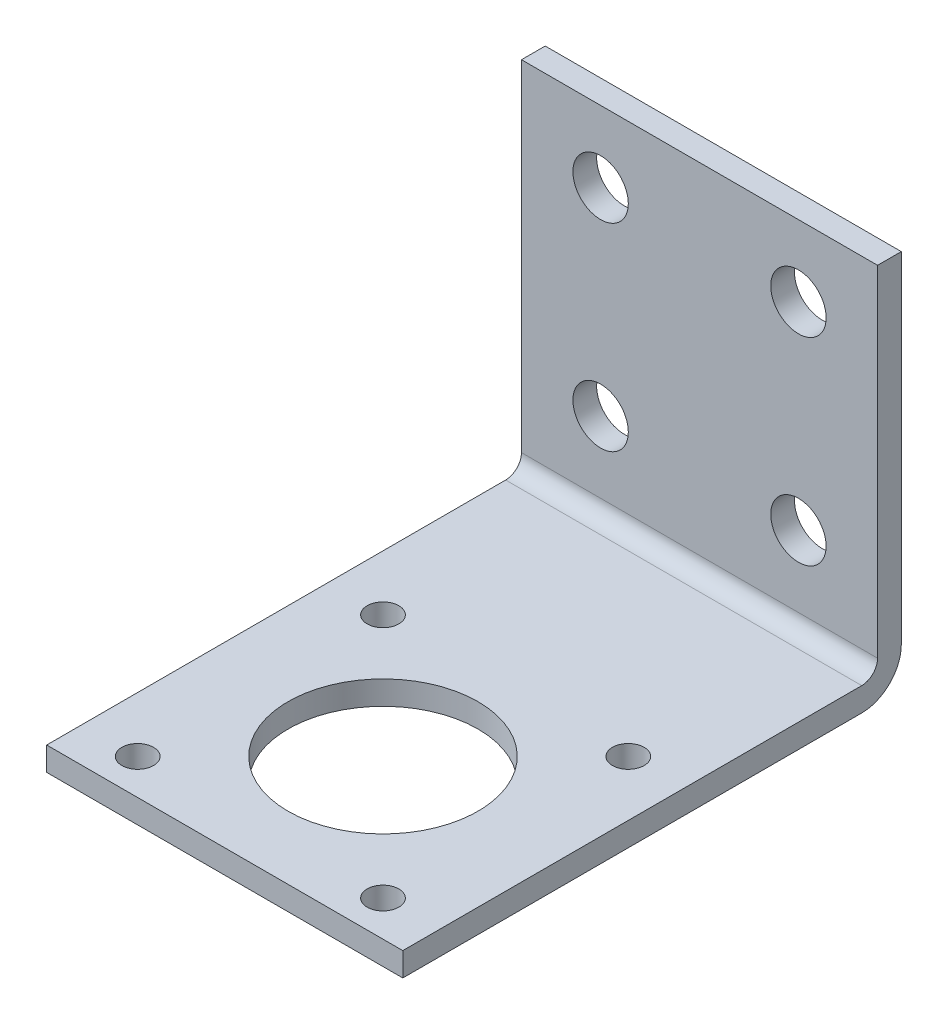
ISO-10303-21;
HEADER;
FILE_DESCRIPTION(('STEP AP214'),'2;1');
FILE_NAME('part.step','',(''),(''),'','','');
FILE_SCHEMA(('AUTOMOTIVE_DESIGN { 1 0 10303 214 1 1 1 1 }'));
ENDSEC;
DATA;
#1=APPLICATION_CONTEXT('core data for automotive mechanical design processes');
#2=APPLICATION_PROTOCOL_DEFINITION('international standard','automotive_design',2000,#1);
#3=PRODUCT_CONTEXT('',#1,'mechanical');
#4=PRODUCT('Part','Part','',(#3));
#5=PRODUCT_RELATED_PRODUCT_CATEGORY('part','',(#4));
#6=PRODUCT_DEFINITION_FORMATION('','',#4);
#7=PRODUCT_DEFINITION_CONTEXT('part definition',#1,'design');
#8=PRODUCT_DEFINITION('design','',#6,#7);
#9=PRODUCT_DEFINITION_SHAPE('','',#8);
#10=(LENGTH_UNIT() NAMED_UNIT(*) SI_UNIT(.MILLI.,.METRE.));
#11=(NAMED_UNIT(*) PLANE_ANGLE_UNIT() SI_UNIT($,.RADIAN.));
#12=(NAMED_UNIT(*) SI_UNIT($,.STERADIAN.) SOLID_ANGLE_UNIT());
#13=UNCERTAINTY_MEASURE_WITH_UNIT(LENGTH_MEASURE(1.E-05),#10,'distance_accuracy_value','');
#14=(GEOMETRIC_REPRESENTATION_CONTEXT(3) GLOBAL_UNCERTAINTY_ASSIGNED_CONTEXT((#13)) GLOBAL_UNIT_ASSIGNED_CONTEXT((#10,
#11,#12)) REPRESENTATION_CONTEXT('',''));
#15=CARTESIAN_POINT('',(0.,0.,0.));
#16=DIRECTION('',(0.,0.,1.));
#17=DIRECTION('',(1.,0.,0.));
#18=AXIS2_PLACEMENT_3D('',#15,#16,#17);
#19=CARTESIAN_POINT('',(45.,0.,63.));
#20=DIRECTION('',(0.,1.,0.));
#21=DIRECTION('',(0.,0.,1.));
#22=AXIS2_PLACEMENT_3D('',#19,#20,#21);
#23=PLANE('',#22);
#24=CARTESIAN_POINT('',(22.5,0.,43.));
#25=DIRECTION('',(0.,-1.,0.));
#26=DIRECTION('',(0.,0.,-1.));
#27=AXIS2_PLACEMENT_3D('',#24,#25,#26);
#28=CIRCLE('',#27,12.);
#29=CARTESIAN_POINT('',(22.5,0.,31.));
#30=VERTEX_POINT('',#29);
#31=EDGE_CURVE('E206',#30,#30,#28,.T.);
#32=ORIENTED_EDGE('',*,*,#31,.F.);
#33=EDGE_LOOP('',(#32));
#34=FACE_BOUND('',#33,.T.);
#35=CARTESIAN_POINT('',(7.,0.,27.5));
#36=DIRECTION('',(0.,-1.,0.));
#37=DIRECTION('',(0.,0.,-1.));
#38=AXIS2_PLACEMENT_3D('',#35,#36,#37);
#39=CIRCLE('',#38,2.);
#40=CARTESIAN_POINT('',(7.,0.,25.5));
#41=VERTEX_POINT('',#40);
#42=EDGE_CURVE('E200',#41,#41,#39,.T.);
#43=ORIENTED_EDGE('',*,*,#42,.F.);
#44=EDGE_LOOP('',(#43));
#45=FACE_BOUND('',#44,.T.);
#46=CARTESIAN_POINT('',(7.,0.,58.5));
#47=DIRECTION('',(0.,-1.,0.));
#48=DIRECTION('',(0.,0.,-1.));
#49=AXIS2_PLACEMENT_3D('',#46,#47,#48);
#50=CIRCLE('',#49,2.);
#51=CARTESIAN_POINT('',(7.,0.,56.5));
#52=VERTEX_POINT('',#51);
#53=EDGE_CURVE('E194',#52,#52,#50,.T.);
#54=ORIENTED_EDGE('',*,*,#53,.F.);
#55=EDGE_LOOP('',(#54));
#56=FACE_BOUND('',#55,.T.);
#57=CARTESIAN_POINT('',(38.,0.,27.5));
#58=DIRECTION('',(0.,-1.,0.));
#59=DIRECTION('',(0.,0.,-1.));
#60=AXIS2_PLACEMENT_3D('',#57,#58,#59);
#61=CIRCLE('',#60,2.);
#62=CARTESIAN_POINT('',(38.,0.,25.5));
#63=VERTEX_POINT('',#62);
#64=EDGE_CURVE('E188',#63,#63,#61,.T.);
#65=ORIENTED_EDGE('',*,*,#64,.F.);
#66=EDGE_LOOP('',(#65));
#67=FACE_BOUND('',#66,.T.);
#68=CARTESIAN_POINT('',(38.,0.,58.5));
#69=DIRECTION('',(0.,-1.,0.));
#70=DIRECTION('',(0.,0.,-1.));
#71=AXIS2_PLACEMENT_3D('',#68,#69,#70);
#72=CIRCLE('',#71,2.);
#73=CARTESIAN_POINT('',(38.,0.,56.5));
#74=VERTEX_POINT('',#73);
#75=EDGE_CURVE('E182',#74,#74,#72,.T.);
#76=ORIENTED_EDGE('',*,*,#75,.F.);
#77=EDGE_LOOP('',(#76));
#78=FACE_BOUND('',#77,.T.);
#79=DIRECTION('',(0.,0.,-1.));
#80=VECTOR('',#79,1.);
#81=CARTESIAN_POINT('',(0.,0.,63.));
#82=LINE('',#81,#80);
#83=CARTESIAN_POINT('',(0.,0.,63.));
#84=VERTEX_POINT('',#83);
#85=CARTESIAN_POINT('',(0.,0.,5.));
#86=VERTEX_POINT('',#85);
#87=EDGE_CURVE('E130',#84,#86,#82,.T.);
#88=ORIENTED_EDGE('',*,*,#87,.T.);
#89=DIRECTION('',(-1.,0.,0.));
#90=VECTOR('',#89,1.);
#91=CARTESIAN_POINT('',(45.,0.,5.));
#92=LINE('',#91,#90);
#93=CARTESIAN_POINT('',(45.,0.,5.));
#94=VERTEX_POINT('',#93);
#95=EDGE_CURVE('E39',#86,#94,#92,.F.);
#96=ORIENTED_EDGE('',*,*,#95,.T.);
#97=DIRECTION('',(0.,0.,-1.));
#98=VECTOR('',#97,1.);
#99=CARTESIAN_POINT('',(45.,0.,63.));
#100=LINE('',#99,#98);
#101=CARTESIAN_POINT('',(45.,0.,63.));
#102=VERTEX_POINT('',#101);
#103=EDGE_CURVE('E106',#102,#94,#100,.T.);
#104=ORIENTED_EDGE('',*,*,#103,.F.);
#105=DIRECTION('',(-1.,0.,0.));
#106=VECTOR('',#105,1.);
#107=CARTESIAN_POINT('',(45.,0.,63.));
#108=LINE('',#107,#106);
#109=EDGE_CURVE('E129',#102,#84,#108,.T.);
#110=ORIENTED_EDGE('',*,*,#109,.T.);
#111=EDGE_LOOP('',(#88,#96,#104,#110));
#112=FACE_BOUND('',#111,.T.);
#113=ADVANCED_FACE('F31',(#34,#45,#56,#67,#78,#112),#23,.F.);
#114=CARTESIAN_POINT('',(45.,0.,0.));
#115=DIRECTION('',(0.,0.,1.));
#116=DIRECTION('',(0.,-1.,0.));
#117=AXIS2_PLACEMENT_3D('',#114,#115,#116);
#118=PLANE('',#117);
#119=CARTESIAN_POINT('',(10.,14.,0.));
#120=DIRECTION('',(0.,0.,1.));
#121=DIRECTION('',(1.,0.,0.));
#122=AXIS2_PLACEMENT_3D('',#119,#120,#121);
#123=CIRCLE('',#122,3.5);
#124=CARTESIAN_POINT('',(13.5,14.,0.));
#125=VERTEX_POINT('',#124);
#126=EDGE_CURVE('E225',#125,#125,#123,.T.);
#127=ORIENTED_EDGE('',*,*,#126,.T.);
#128=EDGE_LOOP('',(#127));
#129=FACE_BOUND('',#128,.T.);
#130=CARTESIAN_POINT('',(10.,39.,0.));
#131=DIRECTION('',(0.,0.,1.));
#132=DIRECTION('',(1.,0.,0.));
#133=AXIS2_PLACEMENT_3D('',#130,#131,#132);
#134=CIRCLE('',#133,3.5);
#135=CARTESIAN_POINT('',(13.5,39.,0.));
#136=VERTEX_POINT('',#135);
#137=EDGE_CURVE('E219',#136,#136,#134,.T.);
#138=ORIENTED_EDGE('',*,*,#137,.T.);
#139=EDGE_LOOP('',(#138));
#140=FACE_BOUND('',#139,.T.);
#141=CARTESIAN_POINT('',(35.,14.,0.));
#142=DIRECTION('',(0.,0.,1.));
#143=DIRECTION('',(1.,0.,0.));
#144=AXIS2_PLACEMENT_3D('',#141,#142,#143);
#145=CIRCLE('',#144,3.5);
#146=CARTESIAN_POINT('',(38.5,14.,0.));
#147=VERTEX_POINT('',#146);
#148=EDGE_CURVE('E213',#147,#147,#145,.T.);
#149=ORIENTED_EDGE('',*,*,#148,.T.);
#150=EDGE_LOOP('',(#149));
#151=FACE_BOUND('',#150,.T.);
#152=CARTESIAN_POINT('',(35.,39.,0.));
#153=DIRECTION('',(0.,0.,1.));
#154=DIRECTION('',(1.,0.,0.));
#155=AXIS2_PLACEMENT_3D('',#152,#153,#154);
#156=CIRCLE('',#155,3.5);
#157=CARTESIAN_POINT('',(38.5,39.,0.));
#158=VERTEX_POINT('',#157);
#159=EDGE_CURVE('E209',#158,#158,#156,.T.);
#160=ORIENTED_EDGE('',*,*,#159,.T.);
#161=EDGE_LOOP('',(#160));
#162=FACE_BOUND('',#161,.T.);
#163=DIRECTION('',(0.,1.,0.));
#164=VECTOR('',#163,1.);
#165=CARTESIAN_POINT('',(45.,0.,0.));
#166=LINE('',#165,#164);
#167=CARTESIAN_POINT('',(45.,5.,0.));
#168=VERTEX_POINT('',#167);
#169=CARTESIAN_POINT('',(45.,48.,0.));
#170=VERTEX_POINT('',#169);
#171=EDGE_CURVE('E95',#168,#170,#166,.T.);
#172=ORIENTED_EDGE('',*,*,#171,.F.);
#173=DIRECTION('',(-1.,0.,0.));
#174=VECTOR('',#173,1.);
#175=CARTESIAN_POINT('',(45.,5.,0.));
#176=LINE('',#175,#174);
#177=CARTESIAN_POINT('',(0.,5.,0.));
#178=VERTEX_POINT('',#177);
#179=EDGE_CURVE('E157',#168,#178,#176,.T.);
#180=ORIENTED_EDGE('',*,*,#179,.T.);
#181=DIRECTION('',(0.,1.,0.));
#182=VECTOR('',#181,1.);
#183=CARTESIAN_POINT('',(0.,0.,0.));
#184=LINE('',#183,#182);
#185=CARTESIAN_POINT('',(0.,48.,0.));
#186=VERTEX_POINT('',#185);
#187=EDGE_CURVE('E111',#178,#186,#184,.T.);
#188=ORIENTED_EDGE('',*,*,#187,.T.);
#189=DIRECTION('',(-1.,0.,0.));
#190=VECTOR('',#189,1.);
#191=CARTESIAN_POINT('',(45.,48.,0.));
#192=LINE('',#191,#190);
#193=EDGE_CURVE('E109',#170,#186,#192,.T.);
#194=ORIENTED_EDGE('',*,*,#193,.F.);
#195=EDGE_LOOP('',(#172,#180,#188,#194));
#196=FACE_BOUND('',#195,.T.);
#197=ADVANCED_FACE('F110',(#129,#140,#151,#162,#196),#118,.F.);
#198=CARTESIAN_POINT('',(45.,48.,0.));
#199=DIRECTION('',(0.,-1.,0.));
#200=DIRECTION('',(0.,0.,-1.));
#201=AXIS2_PLACEMENT_3D('',#198,#199,#200);
#202=PLANE('',#201);
#203=DIRECTION('',(0.,0.,1.));
#204=VECTOR('',#203,1.);
#205=CARTESIAN_POINT('',(0.,48.,0.));
#206=LINE('',#205,#204);
#207=CARTESIAN_POINT('',(0.,48.,3.));
#208=VERTEX_POINT('',#207);
#209=EDGE_CURVE('E134',#186,#208,#206,.T.);
#210=ORIENTED_EDGE('',*,*,#209,.T.);
#211=DIRECTION('',(-1.,0.,0.));
#212=VECTOR('',#211,1.);
#213=CARTESIAN_POINT('',(45.,48.,3.));
#214=LINE('',#213,#212);
#215=CARTESIAN_POINT('',(45.,48.,3.));
#216=VERTEX_POINT('',#215);
#217=EDGE_CURVE('E115',#216,#208,#214,.T.);
#218=ORIENTED_EDGE('',*,*,#217,.F.);
#219=DIRECTION('',(0.,0.,1.));
#220=VECTOR('',#219,1.);
#221=CARTESIAN_POINT('',(45.,48.,0.));
#222=LINE('',#221,#220);
#223=EDGE_CURVE('E100',#170,#216,#222,.T.);
#224=ORIENTED_EDGE('',*,*,#223,.F.);
#225=ORIENTED_EDGE('',*,*,#193,.T.);
#226=EDGE_LOOP('',(#210,#218,#224,#225));
#227=FACE_BOUND('',#226,.T.);
#228=ADVANCED_FACE('F117',(#227),#202,.F.);
#229=CARTESIAN_POINT('',(45.,48.,3.));
#230=DIRECTION('',(0.,0.,-1.));
#231=DIRECTION('',(0.,1.,0.));
#232=AXIS2_PLACEMENT_3D('',#229,#230,#231);
#233=PLANE('',#232);
#234=CARTESIAN_POINT('',(10.,14.,3.));
#235=DIRECTION('',(0.,0.,1.));
#236=DIRECTION('',(1.,0.,0.));
#237=AXIS2_PLACEMENT_3D('',#234,#235,#236);
#238=CIRCLE('',#237,3.5);
#239=CARTESIAN_POINT('',(13.5,14.,3.));
#240=VERTEX_POINT('',#239);
#241=EDGE_CURVE('E228',#240,#240,#238,.T.);
#242=ORIENTED_EDGE('',*,*,#241,.F.);
#243=EDGE_LOOP('',(#242));
#244=FACE_BOUND('',#243,.T.);
#245=CARTESIAN_POINT('',(10.,39.,3.));
#246=DIRECTION('',(0.,0.,1.));
#247=DIRECTION('',(1.,0.,0.));
#248=AXIS2_PLACEMENT_3D('',#245,#246,#247);
#249=CIRCLE('',#248,3.5);
#250=CARTESIAN_POINT('',(13.5,39.,3.));
#251=VERTEX_POINT('',#250);
#252=EDGE_CURVE('E222',#251,#251,#249,.T.);
#253=ORIENTED_EDGE('',*,*,#252,.F.);
#254=EDGE_LOOP('',(#253));
#255=FACE_BOUND('',#254,.T.);
#256=CARTESIAN_POINT('',(35.,14.,3.));
#257=DIRECTION('',(0.,0.,1.));
#258=DIRECTION('',(1.,0.,0.));
#259=AXIS2_PLACEMENT_3D('',#256,#257,#258);
#260=CIRCLE('',#259,3.5);
#261=CARTESIAN_POINT('',(38.5,14.,3.));
#262=VERTEX_POINT('',#261);
#263=EDGE_CURVE('E216',#262,#262,#260,.T.);
#264=ORIENTED_EDGE('',*,*,#263,.F.);
#265=EDGE_LOOP('',(#264));
#266=FACE_BOUND('',#265,.T.);
#267=CARTESIAN_POINT('',(35.,39.,3.));
#268=DIRECTION('',(0.,0.,1.));
#269=DIRECTION('',(1.,0.,0.));
#270=AXIS2_PLACEMENT_3D('',#267,#268,#269);
#271=CIRCLE('',#270,3.5);
#272=CARTESIAN_POINT('',(38.5,39.,3.));
#273=VERTEX_POINT('',#272);
#274=EDGE_CURVE('E210',#273,#273,#271,.T.);
#275=ORIENTED_EDGE('',*,*,#274,.F.);
#276=EDGE_LOOP('',(#275));
#277=FACE_BOUND('',#276,.T.);
#278=DIRECTION('',(0.,-1.,0.));
#279=VECTOR('',#278,1.);
#280=CARTESIAN_POINT('',(0.,48.,3.));
#281=LINE('',#280,#279);
#282=CARTESIAN_POINT('',(0.,5.00000000000002,3.));
#283=VERTEX_POINT('',#282);
#284=EDGE_CURVE('E136',#208,#283,#281,.T.);
#285=ORIENTED_EDGE('',*,*,#284,.T.);
#286=DIRECTION('',(-1.,0.,0.));
#287=VECTOR('',#286,1.);
#288=CARTESIAN_POINT('',(45.,5.,3.));
#289=LINE('',#288,#287);
#290=CARTESIAN_POINT('',(45.,5.00000000000002,3.));
#291=VERTEX_POINT('',#290);
#292=EDGE_CURVE('E151',#283,#291,#289,.F.);
#293=ORIENTED_EDGE('',*,*,#292,.T.);
#294=DIRECTION('',(0.,-1.,0.));
#295=VECTOR('',#294,1.);
#296=CARTESIAN_POINT('',(45.,48.,3.));
#297=LINE('',#296,#295);
#298=EDGE_CURVE('E120',#216,#291,#297,.T.);
#299=ORIENTED_EDGE('',*,*,#298,.F.);
#300=ORIENTED_EDGE('',*,*,#217,.T.);
#301=EDGE_LOOP('',(#285,#293,#299,#300));
#302=FACE_BOUND('',#301,.T.);
#303=ADVANCED_FACE('F163',(#244,#255,#266,#277,#302),#233,.F.);
#304=CARTESIAN_POINT('',(45.,3.00000000000001,3.));
#305=DIRECTION('',(0.,-1.,0.));
#306=DIRECTION('',(0.,0.,-1.));
#307=AXIS2_PLACEMENT_3D('',#304,#305,#306);
#308=PLANE('',#307);
#309=CARTESIAN_POINT('',(22.5,3.,43.));
#310=DIRECTION('',(0.,-1.,0.));
#311=DIRECTION('',(0.,0.,-1.));
#312=AXIS2_PLACEMENT_3D('',#309,#310,#311);
#313=CIRCLE('',#312,12.);
#314=CARTESIAN_POINT('',(22.5,3.,31.));
#315=VERTEX_POINT('',#314);
#316=EDGE_CURVE('E203',#315,#315,#313,.F.);
#317=ORIENTED_EDGE('',*,*,#316,.F.);
#318=EDGE_LOOP('',(#317));
#319=FACE_BOUND('',#318,.T.);
#320=CARTESIAN_POINT('',(7.,3.,27.5));
#321=DIRECTION('',(0.,-1.,0.));
#322=DIRECTION('',(0.,0.,-1.));
#323=AXIS2_PLACEMENT_3D('',#320,#321,#322);
#324=CIRCLE('',#323,2.);
#325=CARTESIAN_POINT('',(7.,3.,25.5));
#326=VERTEX_POINT('',#325);
#327=EDGE_CURVE('E197',#326,#326,#324,.F.);
#328=ORIENTED_EDGE('',*,*,#327,.F.);
#329=EDGE_LOOP('',(#328));
#330=FACE_BOUND('',#329,.T.);
#331=CARTESIAN_POINT('',(7.,3.,58.5));
#332=DIRECTION('',(0.,-1.,0.));
#333=DIRECTION('',(0.,0.,-1.));
#334=AXIS2_PLACEMENT_3D('',#331,#332,#333);
#335=CIRCLE('',#334,2.);
#336=CARTESIAN_POINT('',(7.,3.,56.5));
#337=VERTEX_POINT('',#336);
#338=EDGE_CURVE('E191',#337,#337,#335,.F.);
#339=ORIENTED_EDGE('',*,*,#338,.F.);
#340=EDGE_LOOP('',(#339));
#341=FACE_BOUND('',#340,.T.);
#342=CARTESIAN_POINT('',(38.,3.,27.5));
#343=DIRECTION('',(0.,-1.,0.));
#344=DIRECTION('',(0.,0.,-1.));
#345=AXIS2_PLACEMENT_3D('',#342,#343,#344);
#346=CIRCLE('',#345,2.);
#347=CARTESIAN_POINT('',(38.,3.,25.5));
#348=VERTEX_POINT('',#347);
#349=EDGE_CURVE('E185',#348,#348,#346,.F.);
#350=ORIENTED_EDGE('',*,*,#349,.F.);
#351=EDGE_LOOP('',(#350));
#352=FACE_BOUND('',#351,.T.);
#353=CARTESIAN_POINT('',(38.,3.,58.5));
#354=DIRECTION('',(0.,-1.,0.));
#355=DIRECTION('',(0.,0.,-1.));
#356=AXIS2_PLACEMENT_3D('',#353,#354,#355);
#357=CIRCLE('',#356,2.);
#358=CARTESIAN_POINT('',(38.,3.,56.5));
#359=VERTEX_POINT('',#358);
#360=EDGE_CURVE('E132',#359,#359,#357,.F.);
#361=ORIENTED_EDGE('',*,*,#360,.F.);
#362=EDGE_LOOP('',(#361));
#363=FACE_BOUND('',#362,.T.);
#364=DIRECTION('',(0.,0.,1.));
#365=VECTOR('',#364,1.);
#366=CARTESIAN_POINT('',(45.,3.00000000000001,3.));
#367=LINE('',#366,#365);
#368=CARTESIAN_POINT('',(45.,3.00000000000001,4.99999999999999));
#369=VERTEX_POINT('',#368);
#370=CARTESIAN_POINT('',(45.,3.,63.));
#371=VERTEX_POINT('',#370);
#372=EDGE_CURVE('E122',#369,#371,#367,.T.);
#373=ORIENTED_EDGE('',*,*,#372,.F.);
#374=DIRECTION('',(-1.,0.,0.));
#375=VECTOR('',#374,1.);
#376=CARTESIAN_POINT('',(0.,3.00000000000001,5.));
#377=LINE('',#376,#375);
#378=CARTESIAN_POINT('',(0.,3.00000000000001,4.99999999999999));
#379=VERTEX_POINT('',#378);
#380=EDGE_CURVE('E114',#369,#379,#377,.T.);
#381=ORIENTED_EDGE('',*,*,#380,.T.);
#382=DIRECTION('',(0.,0.,1.));
#383=VECTOR('',#382,1.);
#384=CARTESIAN_POINT('',(0.,3.00000000000001,3.));
#385=LINE('',#384,#383);
#386=CARTESIAN_POINT('',(0.,3.,63.));
#387=VERTEX_POINT('',#386);
#388=EDGE_CURVE('E139',#379,#387,#385,.T.);
#389=ORIENTED_EDGE('',*,*,#388,.T.);
#390=DIRECTION('',(-1.,0.,0.));
#391=VECTOR('',#390,1.);
#392=CARTESIAN_POINT('',(45.,3.,63.));
#393=LINE('',#392,#391);
#394=EDGE_CURVE('E145',#371,#387,#393,.T.);
#395=ORIENTED_EDGE('',*,*,#394,.F.);
#396=EDGE_LOOP('',(#373,#381,#389,#395));
#397=FACE_BOUND('',#396,.T.);
#398=ADVANCED_FACE('F172',(#319,#330,#341,#352,#363,#397),#308,.F.);
#399=CARTESIAN_POINT('',(45.,3.,63.));
#400=DIRECTION('',(0.,0.,-1.));
#401=DIRECTION('',(-1.,0.,0.));
#402=AXIS2_PLACEMENT_3D('',#399,#400,#401);
#403=PLANE('',#402);
#404=DIRECTION('',(0.,-1.,0.));
#405=VECTOR('',#404,1.);
#406=CARTESIAN_POINT('',(0.,3.,63.));
#407=LINE('',#406,#405);
#408=EDGE_CURVE('E141',#387,#84,#407,.T.);
#409=ORIENTED_EDGE('',*,*,#408,.T.);
#410=ORIENTED_EDGE('',*,*,#109,.F.);
#411=DIRECTION('',(0.,-1.,0.));
#412=VECTOR('',#411,1.);
#413=CARTESIAN_POINT('',(45.,3.,63.));
#414=LINE('',#413,#412);
#415=EDGE_CURVE('E127',#371,#102,#414,.T.);
#416=ORIENTED_EDGE('',*,*,#415,.F.);
#417=ORIENTED_EDGE('',*,*,#394,.T.);
#418=EDGE_LOOP('',(#409,#410,#416,#417));
#419=FACE_BOUND('',#418,.T.);
#420=ADVANCED_FACE('F177',(#419),#403,.F.);
#421=CARTESIAN_POINT('',(45.,0.,0.));
#422=DIRECTION('',(1.,0.,0.));
#423=DIRECTION('',(0.,0.,-1.));
#424=AXIS2_PLACEMENT_3D('',#421,#422,#423);
#425=PLANE('',#424);
#426=ORIENTED_EDGE('',*,*,#103,.T.);
#427=CARTESIAN_POINT('',(45.,5.,5.));
#428=DIRECTION('',(1.,0.,0.));
#429=DIRECTION('',(0.,0.,-1.));
#430=AXIS2_PLACEMENT_3D('',#427,#428,#429);
#431=CIRCLE('',#430,5.);
#432=EDGE_CURVE('E11',#94,#168,#431,.T.);
#433=ORIENTED_EDGE('',*,*,#432,.T.);
#434=ORIENTED_EDGE('',*,*,#171,.T.);
#435=ORIENTED_EDGE('',*,*,#223,.T.);
#436=ORIENTED_EDGE('',*,*,#298,.T.);
#437=CARTESIAN_POINT('',(45.,5.,5.));
#438=DIRECTION('',(1.,0.,0.));
#439=DIRECTION('',(0.,0.,-1.));
#440=AXIS2_PLACEMENT_3D('',#437,#438,#439);
#441=CIRCLE('',#440,2.);
#442=EDGE_CURVE('E155',#291,#369,#441,.F.);
#443=ORIENTED_EDGE('',*,*,#442,.T.);
#444=ORIENTED_EDGE('',*,*,#372,.T.);
#445=ORIENTED_EDGE('',*,*,#415,.T.);
#446=EDGE_LOOP('',(#426,#433,#434,#435,#436,#443,#444,#445));
#447=FACE_BOUND('',#446,.T.);
#448=ADVANCED_FACE('F97',(#447),#425,.T.);
#449=CARTESIAN_POINT('',(0.,0.,0.));
#450=DIRECTION('',(1.,0.,0.));
#451=DIRECTION('',(0.,0.,-1.));
#452=AXIS2_PLACEMENT_3D('',#449,#450,#451);
#453=PLANE('',#452);
#454=ORIENTED_EDGE('',*,*,#187,.F.);
#455=CARTESIAN_POINT('',(0.,5.,5.));
#456=DIRECTION('',(1.,0.,0.));
#457=DIRECTION('',(0.,0.,-1.));
#458=AXIS2_PLACEMENT_3D('',#455,#456,#457);
#459=CIRCLE('',#458,5.);
#460=EDGE_CURVE('E53',#178,#86,#459,.F.);
#461=ORIENTED_EDGE('',*,*,#460,.T.);
#462=ORIENTED_EDGE('',*,*,#87,.F.);
#463=ORIENTED_EDGE('',*,*,#408,.F.);
#464=ORIENTED_EDGE('',*,*,#388,.F.);
#465=CARTESIAN_POINT('',(0.,5.,5.));
#466=DIRECTION('',(1.,0.,0.));
#467=DIRECTION('',(0.,0.,-1.));
#468=AXIS2_PLACEMENT_3D('',#465,#466,#467);
#469=CIRCLE('',#468,2.);
#470=EDGE_CURVE('E153',#379,#283,#469,.T.);
#471=ORIENTED_EDGE('',*,*,#470,.T.);
#472=ORIENTED_EDGE('',*,*,#284,.F.);
#473=ORIENTED_EDGE('',*,*,#209,.F.);
#474=EDGE_LOOP('',(#454,#461,#462,#463,#464,#471,#472,#473));
#475=FACE_BOUND('',#474,.T.);
#476=ADVANCED_FACE('F160',(#475),#453,.F.);
#477=CARTESIAN_POINT('',(45.,5.,5.));
#478=DIRECTION('',(1.,0.,0.));
#479=DIRECTION('',(0.,0.,-1.));
#480=AXIS2_PLACEMENT_3D('',#477,#478,#479);
#481=CYLINDRICAL_SURFACE('',#480,2.);
#482=ORIENTED_EDGE('',*,*,#442,.F.);
#483=ORIENTED_EDGE('',*,*,#292,.F.);
#484=ORIENTED_EDGE('',*,*,#470,.F.);
#485=ORIENTED_EDGE('',*,*,#380,.F.);
#486=EDGE_LOOP('',(#482,#483,#484,#485));
#487=FACE_BOUND('',#486,.T.);
#488=ADVANCED_FACE('F169',(#487),#481,.F.);
#489=CARTESIAN_POINT('',(45.,5.,5.));
#490=DIRECTION('',(-1.,0.,0.));
#491=DIRECTION('',(0.,0.,1.));
#492=AXIS2_PLACEMENT_3D('',#489,#490,#491);
#493=CYLINDRICAL_SURFACE('',#492,5.);
#494=ORIENTED_EDGE('',*,*,#432,.F.);
#495=ORIENTED_EDGE('',*,*,#95,.F.);
#496=ORIENTED_EDGE('',*,*,#460,.F.);
#497=ORIENTED_EDGE('',*,*,#179,.F.);
#498=EDGE_LOOP('',(#494,#495,#496,#497));
#499=FACE_BOUND('',#498,.T.);
#500=ADVANCED_FACE('F33',(#499),#493,.T.);
#501=CARTESIAN_POINT('',(38.,48.001,58.5));
#502=DIRECTION('',(0.,-1.,0.));
#503=DIRECTION('',(0.,0.,-1.));
#504=AXIS2_PLACEMENT_3D('',#501,#502,#503);
#505=CYLINDRICAL_SURFACE('',#504,2.);
#506=ORIENTED_EDGE('',*,*,#75,.T.);
#507=EDGE_LOOP('',(#506));
#508=FACE_BOUND('',#507,.T.);
#509=ORIENTED_EDGE('',*,*,#360,.T.);
#510=EDGE_LOOP('',(#509));
#511=FACE_BOUND('',#510,.T.);
#512=ADVANCED_FACE('F284',(#508,#511),#505,.F.);
#513=CARTESIAN_POINT('',(38.,48.001,27.5));
#514=DIRECTION('',(0.,-1.,0.));
#515=DIRECTION('',(0.,0.,-1.));
#516=AXIS2_PLACEMENT_3D('',#513,#514,#515);
#517=CYLINDRICAL_SURFACE('',#516,2.);
#518=ORIENTED_EDGE('',*,*,#64,.T.);
#519=EDGE_LOOP('',(#518));
#520=FACE_BOUND('',#519,.T.);
#521=ORIENTED_EDGE('',*,*,#349,.T.);
#522=EDGE_LOOP('',(#521));
#523=FACE_BOUND('',#522,.T.);
#524=ADVANCED_FACE('F348',(#520,#523),#517,.F.);
#525=CARTESIAN_POINT('',(7.,48.001,58.5));
#526=DIRECTION('',(0.,-1.,0.));
#527=DIRECTION('',(0.,0.,-1.));
#528=AXIS2_PLACEMENT_3D('',#525,#526,#527);
#529=CYLINDRICAL_SURFACE('',#528,2.);
#530=ORIENTED_EDGE('',*,*,#53,.T.);
#531=EDGE_LOOP('',(#530));
#532=FACE_BOUND('',#531,.T.);
#533=ORIENTED_EDGE('',*,*,#338,.T.);
#534=EDGE_LOOP('',(#533));
#535=FACE_BOUND('',#534,.T.);
#536=ADVANCED_FACE('F354',(#532,#535),#529,.F.);
#537=CARTESIAN_POINT('',(7.,48.001,27.5));
#538=DIRECTION('',(0.,-1.,0.));
#539=DIRECTION('',(0.,0.,-1.));
#540=AXIS2_PLACEMENT_3D('',#537,#538,#539);
#541=CYLINDRICAL_SURFACE('',#540,2.);
#542=ORIENTED_EDGE('',*,*,#42,.T.);
#543=EDGE_LOOP('',(#542));
#544=FACE_BOUND('',#543,.T.);
#545=ORIENTED_EDGE('',*,*,#327,.T.);
#546=EDGE_LOOP('',(#545));
#547=FACE_BOUND('',#546,.T.);
#548=ADVANCED_FACE('F264',(#544,#547),#541,.F.);
#549=CARTESIAN_POINT('',(22.5,48.001,43.));
#550=DIRECTION('',(0.,-1.,0.));
#551=DIRECTION('',(0.,0.,-1.));
#552=AXIS2_PLACEMENT_3D('',#549,#550,#551);
#553=CYLINDRICAL_SURFACE('',#552,12.);
#554=ORIENTED_EDGE('',*,*,#31,.T.);
#555=EDGE_LOOP('',(#554));
#556=FACE_BOUND('',#555,.T.);
#557=ORIENTED_EDGE('',*,*,#316,.T.);
#558=EDGE_LOOP('',(#557));
#559=FACE_BOUND('',#558,.T.);
#560=ADVANCED_FACE('F255',(#556,#559),#553,.F.);
#561=CARTESIAN_POINT('',(35.,39.,0.));
#562=DIRECTION('',(0.,0.,1.));
#563=DIRECTION('',(1.,0.,0.));
#564=AXIS2_PLACEMENT_3D('',#561,#562,#563);
#565=CYLINDRICAL_SURFACE('',#564,3.5);
#566=ORIENTED_EDGE('',*,*,#159,.F.);
#567=EDGE_LOOP('',(#566));
#568=FACE_BOUND('',#567,.T.);
#569=ORIENTED_EDGE('',*,*,#274,.T.);
#570=EDGE_LOOP('',(#569));
#571=FACE_BOUND('',#570,.T.);
#572=ADVANCED_FACE('F252',(#568,#571),#565,.F.);
#573=CARTESIAN_POINT('',(35.,14.,0.));
#574=DIRECTION('',(0.,0.,1.));
#575=DIRECTION('',(1.,0.,0.));
#576=AXIS2_PLACEMENT_3D('',#573,#574,#575);
#577=CYLINDRICAL_SURFACE('',#576,3.5);
#578=ORIENTED_EDGE('',*,*,#148,.F.);
#579=EDGE_LOOP('',(#578));
#580=FACE_BOUND('',#579,.T.);
#581=ORIENTED_EDGE('',*,*,#263,.T.);
#582=EDGE_LOOP('',(#581));
#583=FACE_BOUND('',#582,.T.);
#584=ADVANCED_FACE('F254',(#580,#583),#577,.F.);
#585=CARTESIAN_POINT('',(10.,39.,0.));
#586=DIRECTION('',(0.,0.,1.));
#587=DIRECTION('',(1.,0.,0.));
#588=AXIS2_PLACEMENT_3D('',#585,#586,#587);
#589=CYLINDRICAL_SURFACE('',#588,3.5);
#590=ORIENTED_EDGE('',*,*,#137,.F.);
#591=EDGE_LOOP('',(#590));
#592=FACE_BOUND('',#591,.T.);
#593=ORIENTED_EDGE('',*,*,#252,.T.);
#594=EDGE_LOOP('',(#593));
#595=FACE_BOUND('',#594,.T.);
#596=ADVANCED_FACE('F239',(#592,#595),#589,.F.);
#597=CARTESIAN_POINT('',(10.,14.,0.));
#598=DIRECTION('',(0.,0.,1.));
#599=DIRECTION('',(1.,0.,0.));
#600=AXIS2_PLACEMENT_3D('',#597,#598,#599);
#601=CYLINDRICAL_SURFACE('',#600,3.5);
#602=ORIENTED_EDGE('',*,*,#126,.F.);
#603=EDGE_LOOP('',(#602));
#604=FACE_BOUND('',#603,.T.);
#605=ORIENTED_EDGE('',*,*,#241,.T.);
#606=EDGE_LOOP('',(#605));
#607=FACE_BOUND('',#606,.T.);
#608=ADVANCED_FACE('F236',(#604,#607),#601,.F.);
#609=CLOSED_SHELL('',(#113,#197,#228,#303,#398,#420,#448,#476,#488,#500,#512,#524,#536,#548,
#560,#572,#584,#596,#608));
#610=MANIFOLD_SOLID_BREP('B2',#609);
#611=ADVANCED_BREP_SHAPE_REPRESENTATION('',(#18,#610),#14);
#612=SHAPE_DEFINITION_REPRESENTATION(#9,#611);
ENDSEC;
END-ISO-10303-21;
